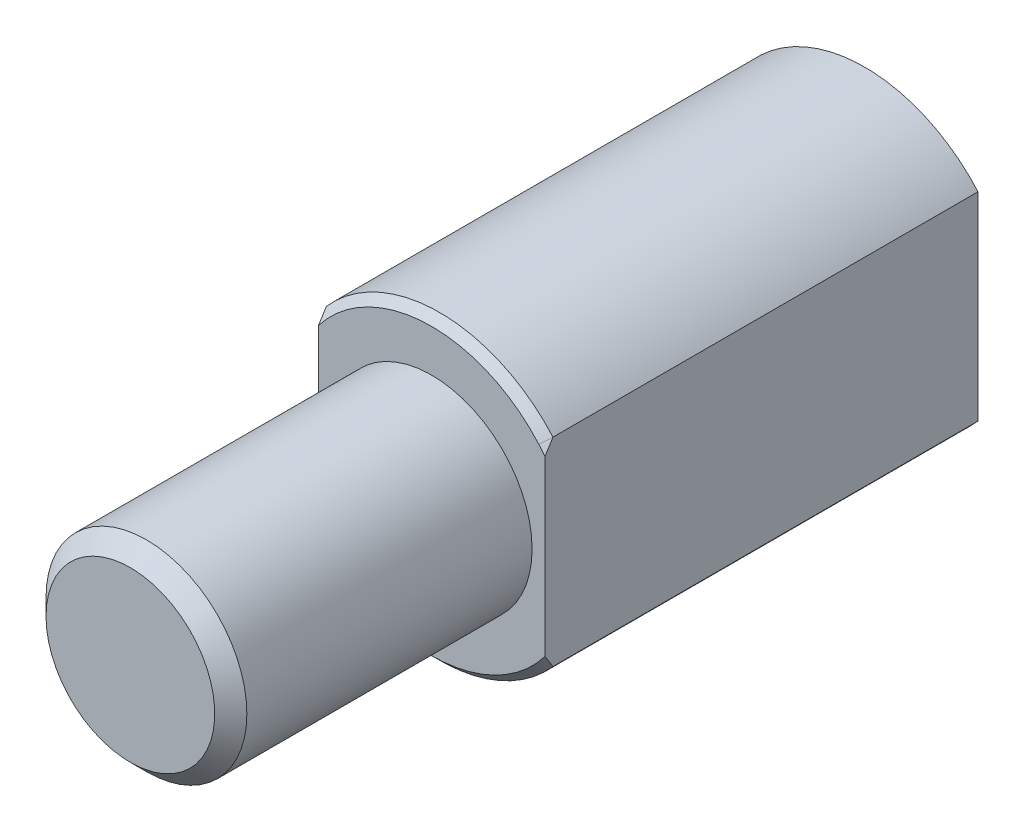
ISO-10303-21;
HEADER;
FILE_DESCRIPTION(('STEP AP214'),'2;1');
FILE_NAME('part.step','',(''),(''),'','','');
FILE_SCHEMA(('AUTOMOTIVE_DESIGN { 1 0 10303 214 1 1 1 1 }'));
ENDSEC;
DATA;
#1=APPLICATION_CONTEXT('core data for automotive mechanical design processes');
#2=APPLICATION_PROTOCOL_DEFINITION('international standard','automotive_design',2000,#1);
#3=PRODUCT_CONTEXT('',#1,'mechanical');
#4=PRODUCT('Part','Part','',(#3));
#5=PRODUCT_RELATED_PRODUCT_CATEGORY('part','',(#4));
#6=PRODUCT_DEFINITION_FORMATION('','',#4);
#7=PRODUCT_DEFINITION_CONTEXT('part definition',#1,'design');
#8=PRODUCT_DEFINITION('design','',#6,#7);
#9=PRODUCT_DEFINITION_SHAPE('','',#8);
#10=(LENGTH_UNIT() NAMED_UNIT(*) SI_UNIT(.MILLI.,.METRE.));
#11=(NAMED_UNIT(*) PLANE_ANGLE_UNIT() SI_UNIT($,.RADIAN.));
#12=(NAMED_UNIT(*) SI_UNIT($,.STERADIAN.) SOLID_ANGLE_UNIT());
#13=UNCERTAINTY_MEASURE_WITH_UNIT(LENGTH_MEASURE(1.E-05),#10,'distance_accuracy_value','');
#14=(GEOMETRIC_REPRESENTATION_CONTEXT(3) GLOBAL_UNCERTAINTY_ASSIGNED_CONTEXT((#13)) GLOBAL_UNIT_ASSIGNED_CONTEXT((#10,
#11,#12)) REPRESENTATION_CONTEXT('',''));
#15=CARTESIAN_POINT('',(0.,0.,0.));
#16=DIRECTION('',(0.,0.,1.));
#17=DIRECTION('',(1.,0.,0.));
#18=AXIS2_PLACEMENT_3D('',#15,#16,#17);
#19=CARTESIAN_POINT('',(0.,0.,23.2156));
#20=DIRECTION('',(0.,0.,-1.));
#21=DIRECTION('',(-1.,0.,0.));
#22=AXIS2_PLACEMENT_3D('',#19,#20,#21);
#23=PLANE('',#22);
#24=CARTESIAN_POINT('',(0.,0.,23.2156000001851));
#25=DIRECTION('',(0.,0.,-1.));
#26=DIRECTION('',(-1.,0.,0.));
#27=AXIS2_PLACEMENT_3D('',#24,#25,#26);
#28=CIRCLE('',#27,2.66700000025821);
#29=CARTESIAN_POINT('',(-2.66700000025821,0.,23.2156000001851));
#30=VERTEX_POINT('',#29);
#31=EDGE_CURVE('E20',#30,#30,#28,.T.);
#32=ORIENTED_EDGE('',*,*,#31,.F.);
#33=EDGE_LOOP('',(#32));
#34=FACE_BOUND('',#33,.T.);
#35=ADVANCED_FACE('F17',(#34),#23,.F.);
#36=CARTESIAN_POINT('',(0.,0.,22.7075999997624));
#37=DIRECTION('',(0.,0.,-1.));
#38=DIRECTION('',(-1.,0.,0.));
#39=AXIS2_PLACEMENT_3D('',#36,#37,#38);
#40=CONICAL_SURFACE('',#39,3.17499999977144,0.785398162502276);
#41=ORIENTED_EDGE('',*,*,#31,.T.);
#42=EDGE_LOOP('',(#41));
#43=FACE_BOUND('',#42,.T.);
#44=CARTESIAN_POINT('',(0.,0.,22.7076));
#45=DIRECTION('',(0.,0.,1.));
#46=DIRECTION('',(1.,0.,0.));
#47=AXIS2_PLACEMENT_3D('',#44,#45,#46);
#48=CIRCLE('',#47,3.175);
#49=CARTESIAN_POINT('',(3.175,0.,22.7076));
#50=VERTEX_POINT('',#49);
#51=EDGE_CURVE('E85',#50,#50,#48,.F.);
#52=ORIENTED_EDGE('',*,*,#51,.F.);
#53=EDGE_LOOP('',(#52));
#54=FACE_BOUND('',#53,.T.);
#55=ADVANCED_FACE('F128',(#43,#54),#40,.T.);
#56=CARTESIAN_POINT('',(0.,0.,13.4365999999773));
#57=DIRECTION('',(0.,0.,-1.));
#58=DIRECTION('',(-1.,0.,0.));
#59=AXIS2_PLACEMENT_3D('',#56,#57,#58);
#60=CONICAL_SURFACE('',#59,4.76249999976271,0.785398162276143);
#61=CARTESIAN_POINT('',(-3.5813999998731,3.13926429108821,13.4365999999087));
#62=CARTESIAN_POINT('',(-3.58140000454294,3.12230536380526,13.4477786765015));
#63=CARTESIAN_POINT('',(-3.58140006977895,3.10532288406468,13.4589216441388));
#64=CARTESIAN_POINT('',(-3.58140024856489,3.07144228154404,13.4810472152502));
#65=CARTESIAN_POINT('',(-3.58140036173429,3.05454453292714,13.4920303917058));
#66=CARTESIAN_POINT('',(-3.58140056508358,3.02083250133728,13.5138363934031));
#67=CARTESIAN_POINT('',(-3.58140065543588,3.0040185952121,13.5246598011788));
#68=CARTESIAN_POINT('',(-3.58140077718058,2.97047331016573,13.5461462497149));
#69=CARTESIAN_POINT('',(-3.58140080902742,2.95374231069186,13.5568098828324));
#70=CARTESIAN_POINT('',(-3.58140080272026,2.92036186284633,13.5779767743771));
#71=CARTESIAN_POINT('',(-3.58140076511034,2.90371279633916,13.5884806349498));
#72=CARTESIAN_POINT('',(-3.58140063524506,2.87049519659446,13.6093279694371));
#73=CARTESIAN_POINT('',(-3.58140054341801,2.85392704746289,13.6196720553254));
#74=CARTESIAN_POINT('',(-3.58140034251342,2.82087022481557,13.6401998373807));
#75=CARTESIAN_POINT('',(-3.5814002335758,2.80438193743091,13.6503841552629));
#76=CARTESIAN_POINT('',(-3.58140006468994,2.7714837323486,13.6705923672382));
#77=CARTESIAN_POINT('',(-3.58140000436724,2.7550742026299,13.6806168929845));
#78=CARTESIAN_POINT('',(-3.58140000011307,2.73863949625971,13.6906000001673));
#79=B_SPLINE_CURVE_WITH_KNOTS('',3,(#61,#62,#63,#64,#65,#66,#67,#68,#69,#70,#71,#72,#73,#74,#75,
#76,#77,#78),.UNSPECIFIED.,.F.,.F.,(4,2,2,2,2,2,2,2,4),(0.,0.0609352843458186,0.121395633617252,
0.181384452323312,0.240905291018555,0.299961850890265,0.358557988421669,0.416697720128296,
0.474385227363865),.UNSPECIFIED.);
#80=CARTESIAN_POINT('',(-3.58139999993655,3.13926429114383,13.4365999999544));
#81=VERTEX_POINT('',#80);
#82=CARTESIAN_POINT('',(-3.58140000005654,2.73863949636284,13.6906000001495));
#83=VERTEX_POINT('',#82);
#84=EDGE_CURVE('E74',#81,#83,#79,.T.);
#85=ORIENTED_EDGE('',*,*,#84,.T.);
#86=CARTESIAN_POINT('',(0.,0.,13.6906000001318));
#87=DIRECTION('',(0.,0.,-1.));
#88=DIRECTION('',(-1.,0.,0.));
#89=AXIS2_PLACEMENT_3D('',#86,#87,#88);
#90=CIRCLE('',#89,4.50850000017782);
#91=CARTESIAN_POINT('',(3.39039200011196,2.9718368624237,13.6906000001318));
#92=VERTEX_POINT('',#91);
#93=EDGE_CURVE('E80',#92,#83,#90,.F.);
#94=ORIENTED_EDGE('',*,*,#93,.F.);
#95=DIRECTION('',(-0.531744298975069,-0.466098701575172,0.707106781821141));
#96=VECTOR('',#95,1.);
#97=CARTESIAN_POINT('',(375261.685049649,328934.385360948,-499000.));
#98=LINE('',#97,#96);
#99=CARTESIAN_POINT('',(3.58139999991636,3.13926429114986,13.4365999998749));
#100=VERTEX_POINT('',#99);
#101=EDGE_CURVE('E111',#100,#92,#98,.T.);
#102=ORIENTED_EDGE('',*,*,#101,.F.);
#103=CARTESIAN_POINT('',(0.,0.,13.4366));
#104=DIRECTION('',(0.,0.,1.));
#105=DIRECTION('',(1.,0.,0.));
#106=AXIS2_PLACEMENT_3D('',#103,#104,#105);
#107=CIRCLE('',#106,4.7625);
#108=EDGE_CURVE('E83',#81,#100,#107,.F.);
#109=ORIENTED_EDGE('',*,*,#108,.F.);
#110=EDGE_LOOP('',(#85,#94,#102,#109));
#111=FACE_BOUND('',#110,.T.);
#112=ADVANCED_FACE('F79',(#111),#60,.T.);
#113=CARTESIAN_POINT('',(0.,0.,13.6906));
#114=DIRECTION('',(0.,0.,1.));
#115=DIRECTION('',(1.,0.,0.));
#116=AXIS2_PLACEMENT_3D('',#113,#114,#115);
#117=CYLINDRICAL_SURFACE('',#116,3.175);
#118=ORIENTED_EDGE('',*,*,#51,.T.);
#119=EDGE_LOOP('',(#118));
#120=FACE_BOUND('',#119,.T.);
#121=CARTESIAN_POINT('',(0.,0.,13.6906));
#122=DIRECTION('',(0.,0.,1.));
#123=DIRECTION('',(1.,0.,0.));
#124=AXIS2_PLACEMENT_3D('',#121,#122,#123);
#125=CIRCLE('',#124,3.175);
#126=CARTESIAN_POINT('',(3.175,0.,13.6906));
#127=VERTEX_POINT('',#126);
#128=EDGE_CURVE('E110',#127,#127,#125,.F.);
#129=ORIENTED_EDGE('',*,*,#128,.F.);
#130=EDGE_LOOP('',(#129));
#131=FACE_BOUND('',#130,.T.);
#132=ADVANCED_FACE('F127',(#120,#131),#117,.T.);
#133=CARTESIAN_POINT('',(0.,0.,13.4350760000075));
#134=DIRECTION('',(0.,0.,-1.));
#135=DIRECTION('',(0.,1.,0.));
#136=AXIS2_PLACEMENT_3D('',#133,#134,#135);
#137=CONICAL_SURFACE('',#136,4.76402399978351,0.785398162382657);
#138=CARTESIAN_POINT('',(0.,0.,13.6906000001318));
#139=DIRECTION('',(0.,0.,-1.));
#140=DIRECTION('',(0.,1.,0.));
#141=AXIS2_PLACEMENT_3D('',#138,#139,#140);
#142=CIRCLE('',#141,4.50850000017782);
#143=CARTESIAN_POINT('',(-3.5814,-2.73863949631961,13.6906000000659));
#144=VERTEX_POINT('',#143);
#145=CARTESIAN_POINT('',(-3.39039200011196,-2.9718368624237,13.6906000001318));
#146=VERTEX_POINT('',#145);
#147=EDGE_CURVE('E95',#144,#146,#142,.F.);
#148=ORIENTED_EDGE('',*,*,#147,.F.);
#149=CARTESIAN_POINT('',(-3.5814,-3.13926429119945,13.4366));
#150=CARTESIAN_POINT('',(-3.5814,-2.93346388279582,13.5722560363708));
#151=CARTESIAN_POINT('',(-3.5814,-2.73863949617325,13.6906));
#152=B_SPLINE_CURVE_WITH_KNOTS('',2,(#149,#150,#151),.UNSPECIFIED.,.F.,.F.,(3,3),(0.,1.),.UNSPECIFIED.);
#153=CARTESIAN_POINT('',(-3.58139999990885,-3.13926429114094,13.4365999998749));
#154=VERTEX_POINT('',#153);
#155=EDGE_CURVE('E99',#154,#144,#152,.T.);
#156=ORIENTED_EDGE('',*,*,#155,.F.);
#157=DIRECTION('',(0.531744298975069,0.466098701575172,0.707106781821141));
#158=VECTOR('',#157,1.);
#159=CARTESIAN_POINT('',(-375261.685049649,-328934.385360948,-499000.));
#160=LINE('',#159,#158);
#161=EDGE_CURVE('E107',#146,#154,#160,.F.);
#162=ORIENTED_EDGE('',*,*,#161,.F.);
#163=EDGE_LOOP('',(#148,#156,#162));
#164=FACE_BOUND('',#163,.T.);
#165=ADVANCED_FACE('F204',(#164),#137,.T.);
#166=CARTESIAN_POINT('',(0.,0.,0.));
#167=DIRECTION('',(0.,0.,1.));
#168=DIRECTION('',(1.,0.,0.));
#169=AXIS2_PLACEMENT_3D('',#166,#167,#168);
#170=CYLINDRICAL_SURFACE('',#169,4.7625);
#171=CARTESIAN_POINT('',(0.,0.,0.));
#172=DIRECTION('',(0.,0.,1.));
#173=DIRECTION('',(1.,0.,0.));
#174=AXIS2_PLACEMENT_3D('',#171,#172,#173);
#175=CIRCLE('',#174,4.7625);
#176=CARTESIAN_POINT('',(3.5814,3.13926429119945,0.));
#177=VERTEX_POINT('',#176);
#178=CARTESIAN_POINT('',(-3.5814,3.13926429119945,0.));
#179=VERTEX_POINT('',#178);
#180=EDGE_CURVE('E102',#177,#179,#175,.T.);
#181=ORIENTED_EDGE('',*,*,#180,.T.);
#182=DIRECTION('',(0.,0.,1.));
#183=VECTOR('',#182,1.);
#184=CARTESIAN_POINT('',(-3.5814,3.13926429119945,0.));
#185=LINE('',#184,#183);
#186=EDGE_CURVE('E100',#81,#179,#185,.F.);
#187=ORIENTED_EDGE('',*,*,#186,.F.);
#188=ORIENTED_EDGE('',*,*,#108,.T.);
#189=DIRECTION('',(0.,0.,-1.));
#190=VECTOR('',#189,1.);
#191=CARTESIAN_POINT('',(3.5814,3.13926429119945,0.));
#192=LINE('',#191,#190);
#193=EDGE_CURVE('E164',#177,#100,#192,.F.);
#194=ORIENTED_EDGE('',*,*,#193,.F.);
#195=EDGE_LOOP('',(#181,#187,#188,#194));
#196=FACE_BOUND('',#195,.T.);
#197=ADVANCED_FACE('F201',(#196),#170,.T.);
#198=CARTESIAN_POINT('',(0.,0.,13.4350760000075));
#199=DIRECTION('',(0.,0.,-1.));
#200=DIRECTION('',(0.,1.,0.));
#201=AXIS2_PLACEMENT_3D('',#198,#199,#200);
#202=CONICAL_SURFACE('',#201,4.76402399978351,0.785398162382657);
#203=CARTESIAN_POINT('',(0.,0.,13.6906000001318));
#204=DIRECTION('',(0.,0.,-1.));
#205=DIRECTION('',(0.,1.,0.));
#206=AXIS2_PLACEMENT_3D('',#203,#204,#205);
#207=CIRCLE('',#206,4.50850000017782);
#208=CARTESIAN_POINT('',(3.5814,2.73863949631961,13.6906000000659));
#209=VERTEX_POINT('',#208);
#210=EDGE_CURVE('E94',#209,#92,#207,.F.);
#211=ORIENTED_EDGE('',*,*,#210,.F.);
#212=CARTESIAN_POINT('',(3.5814,3.13926429119945,13.4366));
#213=CARTESIAN_POINT('',(3.5814,2.93346388279582,13.5722560363708));
#214=CARTESIAN_POINT('',(3.5814,2.73863949617325,13.6906));
#215=B_SPLINE_CURVE_WITH_KNOTS('',2,(#212,#213,#214),.UNSPECIFIED.,.F.,.F.,(3,3),(0.,1.),.UNSPECIFIED.);
#216=EDGE_CURVE('E159',#100,#209,#215,.T.);
#217=ORIENTED_EDGE('',*,*,#216,.F.);
#218=ORIENTED_EDGE('',*,*,#101,.T.);
#219=EDGE_LOOP('',(#211,#217,#218));
#220=FACE_BOUND('',#219,.T.);
#221=ADVANCED_FACE('F197',(#220),#202,.T.);
#222=CARTESIAN_POINT('',(0.,0.,13.6906));
#223=DIRECTION('',(0.,0.,1.));
#224=DIRECTION('',(1.,0.,0.));
#225=AXIS2_PLACEMENT_3D('',#222,#223,#224);
#226=PLANE('',#225);
#227=ORIENTED_EDGE('',*,*,#128,.T.);
#228=EDGE_LOOP('',(#227));
#229=FACE_BOUND('',#228,.T.);
#230=DIRECTION('',(0.,1.,0.));
#231=VECTOR('',#230,1.);
#232=CARTESIAN_POINT('',(-3.5814,-3.13926429119945,13.6906));
#233=LINE('',#232,#231);
#234=EDGE_CURVE('E91',#144,#83,#233,.T.);
#235=ORIENTED_EDGE('',*,*,#234,.F.);
#236=ORIENTED_EDGE('',*,*,#147,.T.);
#237=CARTESIAN_POINT('',(0.,0.,13.6906000001318));
#238=DIRECTION('',(0.,0.,-1.));
#239=DIRECTION('',(-1.,0.,0.));
#240=AXIS2_PLACEMENT_3D('',#237,#238,#239);
#241=CIRCLE('',#240,4.50850000017782);
#242=CARTESIAN_POINT('',(3.5814,-2.73863949631961,13.6906000000659));
#243=VERTEX_POINT('',#242);
#244=EDGE_CURVE('E104',#243,#146,#241,.T.);
#245=ORIENTED_EDGE('',*,*,#244,.F.);
#246=DIRECTION('',(0.,1.,0.));
#247=VECTOR('',#246,1.);
#248=CARTESIAN_POINT('',(3.5814,3.13926429119945,13.6906));
#249=LINE('',#248,#247);
#250=EDGE_CURVE('E163',#209,#243,#249,.F.);
#251=ORIENTED_EDGE('',*,*,#250,.F.);
#252=ORIENTED_EDGE('',*,*,#210,.T.);
#253=ORIENTED_EDGE('',*,*,#93,.T.);
#254=EDGE_LOOP('',(#235,#236,#245,#251,#252,#253));
#255=FACE_BOUND('',#254,.T.);
#256=ADVANCED_FACE('F89',(#229,#255),#226,.T.);
#257=CARTESIAN_POINT('',(0.,0.,13.4365999999773));
#258=DIRECTION('',(0.,0.,-1.));
#259=DIRECTION('',(-1.,0.,0.));
#260=AXIS2_PLACEMENT_3D('',#257,#258,#259);
#261=CONICAL_SURFACE('',#260,4.76249999976271,0.785398162276143);
#262=CARTESIAN_POINT('',(3.5814,-2.73863949617325,13.6906));
#263=CARTESIAN_POINT('',(3.5814,-2.93346388279202,13.5722560363731));
#264=CARTESIAN_POINT('',(3.5814,-3.13926429119945,13.4366));
#265=B_SPLINE_CURVE_WITH_KNOTS('',2,(#262,#263,#264),.UNSPECIFIED.,.F.,.F.,(3,3),(0.,1.),.UNSPECIFIED.);
#266=CARTESIAN_POINT('',(3.5814,-3.13926429119945,13.4366));
#267=VERTEX_POINT('',#266);
#268=EDGE_CURVE('E156',#243,#267,#265,.T.);
#269=ORIENTED_EDGE('',*,*,#268,.F.);
#270=ORIENTED_EDGE('',*,*,#244,.T.);
#271=ORIENTED_EDGE('',*,*,#161,.T.);
#272=CARTESIAN_POINT('',(0.,0.,13.4366));
#273=DIRECTION('',(0.,0.,1.));
#274=DIRECTION('',(1.,0.,0.));
#275=AXIS2_PLACEMENT_3D('',#272,#273,#274);
#276=CIRCLE('',#275,4.7625);
#277=EDGE_CURVE('E172',#267,#154,#276,.F.);
#278=ORIENTED_EDGE('',*,*,#277,.F.);
#279=EDGE_LOOP('',(#269,#270,#271,#278));
#280=FACE_BOUND('',#279,.T.);
#281=ADVANCED_FACE('F191',(#280),#261,.T.);
#282=CARTESIAN_POINT('',(-3.5814,-3.13926429119945,0.));
#283=DIRECTION('',(-1.,0.,0.));
#284=DIRECTION('',(0.,0.,1.));
#285=AXIS2_PLACEMENT_3D('',#282,#283,#284);
#286=PLANE('',#285);
#287=DIRECTION('',(0.,1.,0.));
#288=VECTOR('',#287,1.);
#289=CARTESIAN_POINT('',(-3.5814,0.,0.));
#290=LINE('',#289,#288);
#291=CARTESIAN_POINT('',(-3.5814,-3.13926429119945,0.));
#292=VERTEX_POINT('',#291);
#293=EDGE_CURVE('E179',#179,#292,#290,.F.);
#294=ORIENTED_EDGE('',*,*,#293,.T.);
#295=DIRECTION('',(0.,0.,1.));
#296=VECTOR('',#295,1.);
#297=CARTESIAN_POINT('',(-3.5814,-3.13926429119945,0.));
#298=LINE('',#297,#296);
#299=EDGE_CURVE('E176',#154,#292,#298,.F.);
#300=ORIENTED_EDGE('',*,*,#299,.F.);
#301=ORIENTED_EDGE('',*,*,#155,.T.);
#302=ORIENTED_EDGE('',*,*,#234,.T.);
#303=ORIENTED_EDGE('',*,*,#84,.F.);
#304=ORIENTED_EDGE('',*,*,#186,.T.);
#305=EDGE_LOOP('',(#294,#300,#301,#302,#303,#304));
#306=FACE_BOUND('',#305,.T.);
#307=ADVANCED_FACE('F97',(#306),#286,.T.);
#308=CARTESIAN_POINT('',(0.,0.,0.));
#309=DIRECTION('',(0.,0.,1.));
#310=DIRECTION('',(1.,0.,0.));
#311=AXIS2_PLACEMENT_3D('',#308,#309,#310);
#312=PLANE('',#311);
#313=ORIENTED_EDGE('',*,*,#180,.F.);
#314=DIRECTION('',(0.,1.,0.));
#315=VECTOR('',#314,1.);
#316=CARTESIAN_POINT('',(3.5814,3.13926429119945,0.));
#317=LINE('',#316,#315);
#318=CARTESIAN_POINT('',(3.5814,-3.13926429119945,0.));
#319=VERTEX_POINT('',#318);
#320=EDGE_CURVE('E35',#319,#177,#317,.T.);
#321=ORIENTED_EDGE('',*,*,#320,.F.);
#322=CARTESIAN_POINT('',(0.,0.,0.));
#323=DIRECTION('',(0.,0.,1.));
#324=DIRECTION('',(1.,0.,0.));
#325=AXIS2_PLACEMENT_3D('',#322,#323,#324);
#326=CIRCLE('',#325,4.7625);
#327=EDGE_CURVE('E26',#292,#319,#326,.T.);
#328=ORIENTED_EDGE('',*,*,#327,.F.);
#329=ORIENTED_EDGE('',*,*,#293,.F.);
#330=EDGE_LOOP('',(#313,#321,#328,#329));
#331=FACE_BOUND('',#330,.T.);
#332=ADVANCED_FACE('F147',(#331),#312,.F.);
#333=CARTESIAN_POINT('',(3.5814,3.13926429119945,0.));
#334=DIRECTION('',(1.,0.,0.));
#335=DIRECTION('',(0.,0.,-1.));
#336=AXIS2_PLACEMENT_3D('',#333,#334,#335);
#337=PLANE('',#336);
#338=ORIENTED_EDGE('',*,*,#216,.T.);
#339=ORIENTED_EDGE('',*,*,#250,.T.);
#340=ORIENTED_EDGE('',*,*,#268,.T.);
#341=DIRECTION('',(0.,0.,1.));
#342=VECTOR('',#341,1.);
#343=CARTESIAN_POINT('',(3.5814,-3.13926429119945,0.));
#344=LINE('',#343,#342);
#345=EDGE_CURVE('E11',#319,#267,#344,.T.);
#346=ORIENTED_EDGE('',*,*,#345,.F.);
#347=ORIENTED_EDGE('',*,*,#320,.T.);
#348=ORIENTED_EDGE('',*,*,#193,.T.);
#349=EDGE_LOOP('',(#338,#339,#340,#346,#347,#348));
#350=FACE_BOUND('',#349,.T.);
#351=ADVANCED_FACE('F141',(#350),#337,.T.);
#352=CARTESIAN_POINT('',(0.,0.,0.));
#353=DIRECTION('',(0.,0.,1.));
#354=DIRECTION('',(1.,0.,0.));
#355=AXIS2_PLACEMENT_3D('',#352,#353,#354);
#356=CYLINDRICAL_SURFACE('',#355,4.7625);
#357=ORIENTED_EDGE('',*,*,#327,.T.);
#358=ORIENTED_EDGE('',*,*,#345,.T.);
#359=ORIENTED_EDGE('',*,*,#277,.T.);
#360=ORIENTED_EDGE('',*,*,#299,.T.);
#361=EDGE_LOOP('',(#357,#358,#359,#360));
#362=FACE_BOUND('',#361,.T.);
#363=ADVANCED_FACE('F139',(#362),#356,.T.);
#364=CLOSED_SHELL('',(#35,#55,#112,#132,#165,#197,#221,#256,#281,#307,#332,#351,#363));
#365=MANIFOLD_SOLID_BREP('B1',#364);
#366=ADVANCED_BREP_SHAPE_REPRESENTATION('',(#18,#365),#14);
#367=SHAPE_DEFINITION_REPRESENTATION(#9,#366);
ENDSEC;
END-ISO-10303-21;
